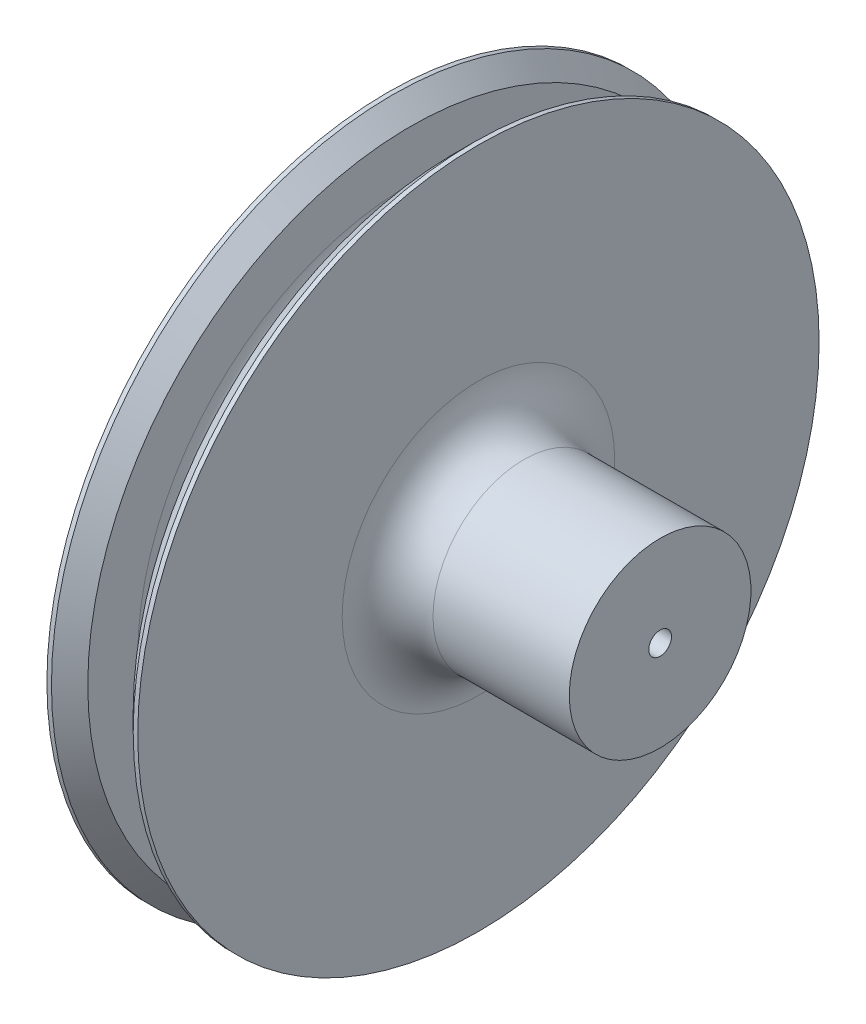
ISO-10303-21;
HEADER;
FILE_DESCRIPTION(('STEP AP214'),'2;1');
FILE_NAME('part.step','',(''),(''),'','','');
FILE_SCHEMA(('AUTOMOTIVE_DESIGN { 1 0 10303 214 1 1 1 1 }'));
ENDSEC;
DATA;
#1=APPLICATION_CONTEXT('core data for automotive mechanical design processes');
#2=APPLICATION_PROTOCOL_DEFINITION('international standard','automotive_design',2000,#1);
#3=PRODUCT_CONTEXT('',#1,'mechanical');
#4=PRODUCT('Part','Part','',(#3));
#5=PRODUCT_RELATED_PRODUCT_CATEGORY('part','',(#4));
#6=PRODUCT_DEFINITION_FORMATION('','',#4);
#7=PRODUCT_DEFINITION_CONTEXT('part definition',#1,'design');
#8=PRODUCT_DEFINITION('design','',#6,#7);
#9=PRODUCT_DEFINITION_SHAPE('','',#8);
#10=(LENGTH_UNIT() NAMED_UNIT(*) SI_UNIT(.MILLI.,.METRE.));
#11=(NAMED_UNIT(*) PLANE_ANGLE_UNIT() SI_UNIT($,.RADIAN.));
#12=(NAMED_UNIT(*) SI_UNIT($,.STERADIAN.) SOLID_ANGLE_UNIT());
#13=UNCERTAINTY_MEASURE_WITH_UNIT(LENGTH_MEASURE(1.E-05),#10,'distance_accuracy_value','');
#14=(GEOMETRIC_REPRESENTATION_CONTEXT(3) GLOBAL_UNCERTAINTY_ASSIGNED_CONTEXT((#13)) GLOBAL_UNIT_ASSIGNED_CONTEXT((#10,
#11,#12)) REPRESENTATION_CONTEXT('',''));
#15=CARTESIAN_POINT('',(0.,0.,0.));
#16=DIRECTION('',(0.,0.,1.));
#17=DIRECTION('',(1.,0.,0.));
#18=AXIS2_PLACEMENT_3D('',#15,#16,#17);
#19=CARTESIAN_POINT('',(0.,0.,0.));
#20=DIRECTION('',(-1.,0.,0.));
#21=DIRECTION('',(0.,0.,1.));
#22=AXIS2_PLACEMENT_3D('',#19,#20,#21);
#23=TOROIDAL_SURFACE('',#22,19.05,1.58750000000001);
#24=CARTESIAN_POINT('',(1.58750000000001,0.,0.));
#25=DIRECTION('',(-1.,0.,0.));
#26=DIRECTION('',(0.,0.,1.));
#27=AXIS2_PLACEMENT_3D('',#24,#25,#26);
#28=CIRCLE('',#27,19.05);
#29=CARTESIAN_POINT('',(1.58750000000001,0.,19.05));
#30=VERTEX_POINT('',#29);
#31=EDGE_CURVE('E69',#30,#30,#28,.T.);
#32=ORIENTED_EDGE('',*,*,#31,.T.);
#33=EDGE_LOOP('',(#32));
#34=FACE_BOUND('',#33,.T.);
#35=CARTESIAN_POINT('',(-1.58750000000001,0.,0.));
#36=DIRECTION('',(-1.,0.,0.));
#37=DIRECTION('',(0.,0.,1.));
#38=AXIS2_PLACEMENT_3D('',#35,#36,#37);
#39=CIRCLE('',#38,19.05);
#40=CARTESIAN_POINT('',(-1.58750000000001,0.,19.05));
#41=VERTEX_POINT('',#40);
#42=EDGE_CURVE('E78',#41,#41,#39,.T.);
#43=ORIENTED_EDGE('',*,*,#42,.F.);
#44=EDGE_LOOP('',(#43));
#45=FACE_BOUND('',#44,.T.);
#46=ADVANCED_FACE('F39',(#34,#45),#23,.F.);
#47=CARTESIAN_POINT('',(1.58750000000001,-19.05,0.));
#48=DIRECTION('',(-1.,0.,0.));
#49=DIRECTION('',(0.,0.,1.));
#50=AXIS2_PLACEMENT_3D('',#47,#48,#49);
#51=PLANE('',#50);
#52=CARTESIAN_POINT('',(1.58750000000001,0.,0.));
#53=DIRECTION('',(-1.,0.,0.));
#54=DIRECTION('',(0.,0.,1.));
#55=AXIS2_PLACEMENT_3D('',#52,#53,#54);
#56=CIRCLE('',#55,22.5425);
#57=CARTESIAN_POINT('',(1.58750000000001,0.,22.5425));
#58=VERTEX_POINT('',#57);
#59=EDGE_CURVE('E55',#58,#58,#56,.T.);
#60=ORIENTED_EDGE('',*,*,#59,.T.);
#61=EDGE_LOOP('',(#60));
#62=FACE_BOUND('',#61,.T.);
#63=ORIENTED_EDGE('',*,*,#31,.F.);
#64=EDGE_LOOP('',(#63));
#65=FACE_BOUND('',#64,.T.);
#66=ADVANCED_FACE('F114',(#62,#65),#51,.T.);
#67=CARTESIAN_POINT('',(-3.175,0.,0.));
#68=DIRECTION('',(-1.,0.,0.));
#69=DIRECTION('',(0.,0.,1.));
#70=AXIS2_PLACEMENT_3D('',#67,#68,#69);
#71=CYLINDRICAL_SURFACE('',#70,23.8125);
#72=CARTESIAN_POINT('',(2.85750000000003,0.,0.));
#73=DIRECTION('',(-1.,0.,0.));
#74=DIRECTION('',(0.,0.,1.));
#75=AXIS2_PLACEMENT_3D('',#72,#73,#74);
#76=CIRCLE('',#75,23.8125);
#77=CARTESIAN_POINT('',(2.85750000000003,0.,23.8125));
#78=VERTEX_POINT('',#77);
#79=EDGE_CURVE('E51',#78,#78,#76,.F.);
#80=ORIENTED_EDGE('',*,*,#79,.T.);
#81=EDGE_LOOP('',(#80));
#82=FACE_BOUND('',#81,.T.);
#83=CARTESIAN_POINT('',(3.175,0.,0.));
#84=DIRECTION('',(-1.,0.,0.));
#85=DIRECTION('',(0.,0.,1.));
#86=AXIS2_PLACEMENT_3D('',#83,#84,#85);
#87=CIRCLE('',#86,23.8125);
#88=CARTESIAN_POINT('',(3.175,0.,23.8125));
#89=VERTEX_POINT('',#88);
#90=EDGE_CURVE('E72',#89,#89,#87,.T.);
#91=ORIENTED_EDGE('',*,*,#90,.T.);
#92=EDGE_LOOP('',(#91));
#93=FACE_BOUND('',#92,.T.);
#94=ADVANCED_FACE('F121',(#82,#93),#71,.T.);
#95=CARTESIAN_POINT('',(3.175,0.,0.));
#96=DIRECTION('',(1.,0.,0.));
#97=DIRECTION('',(0.,0.,-1.));
#98=AXIS2_PLACEMENT_3D('',#95,#96,#97);
#99=PLANE('',#98);
#100=CARTESIAN_POINT('',(3.175,0.,0.));
#101=DIRECTION('',(1.,0.,0.));
#102=DIRECTION('',(0.,0.,-1.));
#103=AXIS2_PLACEMENT_3D('',#100,#101,#102);
#104=CIRCLE('',#103,9.525);
#105=CARTESIAN_POINT('',(3.175,0.,-9.525));
#106=VERTEX_POINT('',#105);
#107=EDGE_CURVE('E60',#106,#106,#104,.F.);
#108=ORIENTED_EDGE('',*,*,#107,.T.);
#109=EDGE_LOOP('',(#108));
#110=FACE_BOUND('',#109,.T.);
#111=ORIENTED_EDGE('',*,*,#90,.F.);
#112=EDGE_LOOP('',(#111));
#113=FACE_BOUND('',#112,.T.);
#114=ADVANCED_FACE('F148',(#110,#113),#99,.T.);
#115=CARTESIAN_POINT('',(-3.175,-23.8125,0.));
#116=DIRECTION('',(-1.,0.,0.));
#117=DIRECTION('',(0.,0.,1.));
#118=AXIS2_PLACEMENT_3D('',#115,#116,#117);
#119=PLANE('',#118);
#120=CARTESIAN_POINT('',(-3.175,0.,0.));
#121=DIRECTION('',(-1.,0.,0.));
#122=DIRECTION('',(0.,0.,1.));
#123=AXIS2_PLACEMENT_3D('',#120,#121,#122);
#124=CIRCLE('',#123,9.525);
#125=CARTESIAN_POINT('',(-3.175,0.,9.525));
#126=VERTEX_POINT('',#125);
#127=EDGE_CURVE('E66',#126,#126,#124,.F.);
#128=ORIENTED_EDGE('',*,*,#127,.T.);
#129=EDGE_LOOP('',(#128));
#130=FACE_BOUND('',#129,.T.);
#131=CARTESIAN_POINT('',(-3.175,0.,0.));
#132=DIRECTION('',(-1.,0.,0.));
#133=DIRECTION('',(0.,0.,1.));
#134=AXIS2_PLACEMENT_3D('',#131,#132,#133);
#135=CIRCLE('',#134,23.8125);
#136=CARTESIAN_POINT('',(-3.175,0.,23.8125));
#137=VERTEX_POINT('',#136);
#138=EDGE_CURVE('E75',#137,#137,#135,.T.);
#139=ORIENTED_EDGE('',*,*,#138,.T.);
#140=EDGE_LOOP('',(#139));
#141=FACE_BOUND('',#140,.T.);
#142=ADVANCED_FACE('F151',(#130,#141),#119,.T.);
#143=CARTESIAN_POINT('',(-3.175,0.,0.));
#144=DIRECTION('',(-1.,0.,0.));
#145=DIRECTION('',(0.,0.,1.));
#146=AXIS2_PLACEMENT_3D('',#143,#144,#145);
#147=CYLINDRICAL_SURFACE('',#146,23.8125);
#148=CARTESIAN_POINT('',(-2.85750000000002,0.,0.));
#149=DIRECTION('',(1.,0.,0.));
#150=DIRECTION('',(0.,0.,-1.));
#151=AXIS2_PLACEMENT_3D('',#148,#149,#150);
#152=CIRCLE('',#151,23.8125);
#153=CARTESIAN_POINT('',(-2.85750000000002,0.,23.8125));
#154=VERTEX_POINT('',#153);
#155=EDGE_CURVE('E47',#154,#154,#152,.F.);
#156=ORIENTED_EDGE('',*,*,#155,.T.);
#157=EDGE_LOOP('',(#156));
#158=FACE_BOUND('',#157,.T.);
#159=ORIENTED_EDGE('',*,*,#138,.F.);
#160=EDGE_LOOP('',(#159));
#161=FACE_BOUND('',#160,.T.);
#162=ADVANCED_FACE('F157',(#158,#161),#147,.T.);
#163=CARTESIAN_POINT('',(-1.58750000000001,-19.05,0.));
#164=DIRECTION('',(1.,0.,0.));
#165=DIRECTION('',(0.,0.,-1.));
#166=AXIS2_PLACEMENT_3D('',#163,#164,#165);
#167=PLANE('',#166);
#168=CARTESIAN_POINT('',(-1.58750000000001,0.,0.));
#169=DIRECTION('',(1.,0.,0.));
#170=DIRECTION('',(0.,0.,-1.));
#171=AXIS2_PLACEMENT_3D('',#168,#169,#170);
#172=CIRCLE('',#171,22.5425);
#173=CARTESIAN_POINT('',(-1.58750000000001,0.,22.5425));
#174=VERTEX_POINT('',#173);
#175=EDGE_CURVE('E10',#174,#174,#172,.T.);
#176=ORIENTED_EDGE('',*,*,#175,.T.);
#177=EDGE_LOOP('',(#176));
#178=FACE_BOUND('',#177,.T.);
#179=ORIENTED_EDGE('',*,*,#42,.T.);
#180=EDGE_LOOP('',(#179));
#181=FACE_BOUND('',#180,.T.);
#182=ADVANCED_FACE('F163',(#178,#181),#167,.T.);
#183=CARTESIAN_POINT('',(-6.35,0.,0.));
#184=DIRECTION('',(-1.,0.,0.));
#185=DIRECTION('',(0.,0.,1.));
#186=AXIS2_PLACEMENT_3D('',#183,#184,#185);
#187=PLANE('',#186);
#188=CARTESIAN_POINT('',(-6.35,0.,0.));
#189=DIRECTION('',(-1.,0.,0.));
#190=DIRECTION('',(0.,0.,1.));
#191=AXIS2_PLACEMENT_3D('',#188,#189,#190);
#192=CIRCLE('',#191,0.79375);
#193=CARTESIAN_POINT('',(-6.35,0.,0.79375));
#194=VERTEX_POINT('',#193);
#195=EDGE_CURVE('E87',#194,#194,#192,.T.);
#196=ORIENTED_EDGE('',*,*,#195,.F.);
#197=EDGE_LOOP('',(#196));
#198=FACE_BOUND('',#197,.T.);
#199=CARTESIAN_POINT('',(-6.35,0.,0.));
#200=DIRECTION('',(-1.,0.,0.));
#201=DIRECTION('',(0.,0.,1.));
#202=AXIS2_PLACEMENT_3D('',#199,#200,#201);
#203=CIRCLE('',#202,6.35);
#204=CARTESIAN_POINT('',(-6.35,0.,6.35));
#205=VERTEX_POINT('',#204);
#206=EDGE_CURVE('E84',#205,#205,#203,.T.);
#207=ORIENTED_EDGE('',*,*,#206,.T.);
#208=EDGE_LOOP('',(#207));
#209=FACE_BOUND('',#208,.T.);
#210=ADVANCED_FACE('F165',(#198,#209),#187,.T.);
#211=CARTESIAN_POINT('',(15.875,0.,0.));
#212=DIRECTION('',(-1.,0.,0.));
#213=DIRECTION('',(0.,0.,1.));
#214=AXIS2_PLACEMENT_3D('',#211,#212,#213);
#215=CYLINDRICAL_SURFACE('',#214,6.35);
#216=CARTESIAN_POINT('',(6.35,0.,0.));
#217=DIRECTION('',(1.,0.,0.));
#218=DIRECTION('',(0.,0.,-1.));
#219=AXIS2_PLACEMENT_3D('',#216,#217,#218);
#220=CIRCLE('',#219,6.35);
#221=CARTESIAN_POINT('',(6.35,0.,6.35));
#222=VERTEX_POINT('',#221);
#223=EDGE_CURVE('E63',#222,#222,#220,.T.);
#224=CARTESIAN_POINT('',(15.875,0.,0.));
#225=DIRECTION('',(-1.,0.,0.));
#226=DIRECTION('',(0.,0.,1.));
#227=AXIS2_PLACEMENT_3D('',#224,#225,#226);
#228=CIRCLE('',#227,6.35);
#229=CARTESIAN_POINT('',(15.875,0.,6.35));
#230=VERTEX_POINT('',#229);
#231=EDGE_CURVE('E81',#230,#230,#228,.T.);
#232=CARTESIAN_POINT('',(6.35,0.,6.35));
#233=CARTESIAN_POINT('',(6.44921875,0.,6.35));
#234=CARTESIAN_POINT('',(6.5484375,0.,6.35));
#235=CARTESIAN_POINT('',(6.746875,0.,6.35));
#236=CARTESIAN_POINT('',(6.84609375,0.,6.35));
#237=CARTESIAN_POINT('',(7.04453125,0.,6.35));
#238=CARTESIAN_POINT('',(7.14375,0.,6.35));
#239=CARTESIAN_POINT('',(7.3421875,0.,6.35));
#240=CARTESIAN_POINT('',(7.44140625,0.,6.35));
#241=CARTESIAN_POINT('',(7.63984375,0.,6.35));
#242=CARTESIAN_POINT('',(7.7390625,0.,6.35));
#243=CARTESIAN_POINT('',(7.9375,0.,6.35));
#244=CARTESIAN_POINT('',(8.03671875,0.,6.35));
#245=CARTESIAN_POINT('',(8.23515625,0.,6.35));
#246=CARTESIAN_POINT('',(8.334375,0.,6.35));
#247=CARTESIAN_POINT('',(8.5328125,0.,6.35));
#248=CARTESIAN_POINT('',(8.63203125,0.,6.35));
#249=CARTESIAN_POINT('',(8.83046875,0.,6.35));
#250=CARTESIAN_POINT('',(8.9296875,0.,6.35));
#251=CARTESIAN_POINT('',(9.128125,0.,6.35));
#252=CARTESIAN_POINT('',(9.22734375,0.,6.35));
#253=CARTESIAN_POINT('',(9.42578125,0.,6.35));
#254=CARTESIAN_POINT('',(9.525,0.,6.35));
#255=CARTESIAN_POINT('',(9.7234375,0.,6.35));
#256=CARTESIAN_POINT('',(9.82265625,0.,6.35));
#257=CARTESIAN_POINT('',(10.02109375,0.,6.35));
#258=CARTESIAN_POINT('',(10.1203125,0.,6.35));
#259=CARTESIAN_POINT('',(10.31875,0.,6.35));
#260=CARTESIAN_POINT('',(10.41796875,0.,6.35));
#261=CARTESIAN_POINT('',(10.61640625,0.,6.35));
#262=CARTESIAN_POINT('',(10.715625,0.,6.35));
#263=CARTESIAN_POINT('',(10.9140625,0.,6.35));
#264=CARTESIAN_POINT('',(11.01328125,0.,6.35));
#265=CARTESIAN_POINT('',(11.21171875,0.,6.35));
#266=CARTESIAN_POINT('',(11.3109375,0.,6.35));
#267=CARTESIAN_POINT('',(11.509375,0.,6.35));
#268=CARTESIAN_POINT('',(11.60859375,0.,6.35));
#269=CARTESIAN_POINT('',(11.80703125,0.,6.35));
#270=CARTESIAN_POINT('',(11.90625,0.,6.35));
#271=CARTESIAN_POINT('',(12.1046875,0.,6.35));
#272=CARTESIAN_POINT('',(12.20390625,0.,6.35));
#273=CARTESIAN_POINT('',(12.40234375,0.,6.35));
#274=CARTESIAN_POINT('',(12.5015625,0.,6.35));
#275=CARTESIAN_POINT('',(12.7,0.,6.35));
#276=CARTESIAN_POINT('',(12.79921875,0.,6.35));
#277=CARTESIAN_POINT('',(12.99765625,0.,6.35));
#278=CARTESIAN_POINT('',(13.096875,0.,6.35));
#279=CARTESIAN_POINT('',(13.2953125,0.,6.35));
#280=CARTESIAN_POINT('',(13.39453125,0.,6.35));
#281=CARTESIAN_POINT('',(13.59296875,0.,6.35));
#282=CARTESIAN_POINT('',(13.6921875,0.,6.35));
#283=CARTESIAN_POINT('',(13.890625,0.,6.35));
#284=CARTESIAN_POINT('',(13.98984375,0.,6.35));
#285=CARTESIAN_POINT('',(14.18828125,0.,6.35));
#286=CARTESIAN_POINT('',(14.2875,0.,6.35));
#287=CARTESIAN_POINT('',(14.4859375,0.,6.35));
#288=CARTESIAN_POINT('',(14.58515625,0.,6.35));
#289=CARTESIAN_POINT('',(14.78359375,0.,6.35));
#290=CARTESIAN_POINT('',(14.8828125,0.,6.35));
#291=CARTESIAN_POINT('',(15.08125,0.,6.35));
#292=CARTESIAN_POINT('',(15.18046875,0.,6.35));
#293=CARTESIAN_POINT('',(15.37890625,0.,6.35));
#294=CARTESIAN_POINT('',(15.478125,0.,6.35));
#295=CARTESIAN_POINT('',(15.6765625,0.,6.35));
#296=CARTESIAN_POINT('',(15.77578125,0.,6.35));
#297=CARTESIAN_POINT('',(15.875,0.,6.35));
#298=B_SPLINE_CURVE_WITH_KNOTS('',3,(#232,#233,#234,#235,#236,#237,#238,#239,#240,#241,#242,
#243,#244,#245,#246,#247,#248,#249,#250,#251,#252,#253,#254,#255,#256,#257,#258,#259,#260,#261,
#262,#263,#264,#265,#266,#267,#268,#269,#270,#271,#272,#273,#274,#275,#276,#277,#278,#279,#280,
#281,#282,#283,#284,#285,#286,#287,#288,#289,#290,#291,#292,#293,#294,#295,#296,#297),
.UNSPECIFIED.,.F.,.F.,(4,2,2,2,2,2,2,2,2,2,2,2,2,2,2,2,2,2,2,2,2,2,2,2,2,2,2,2,2,2,2,2,4),(0.,
0.29765625,0.5953125,0.892968750000001,1.190625,1.48828125,1.7859375,2.08359375,2.38125,
2.67890625,2.9765625,3.27421875,3.571875,3.86953125,4.1671875,4.46484375,4.7625,5.06015625,
5.3578125,5.65546875,5.953125,6.25078125,6.5484375,6.84609375,7.14375,7.44140625,7.7390625,
8.03671875,8.334375,8.63203125,8.9296875,9.22734375,9.525),.UNSPECIFIED.);
#299=EDGE_CURVE('BSEAM110',#222,#230,#298,.T.);
#300=ORIENTED_EDGE('',*,*,#223,.T.);
#301=ORIENTED_EDGE('',*,*,#231,.T.);
#302=ORIENTED_EDGE('',*,*,#299,.T.);
#303=ORIENTED_EDGE('',*,*,#299,.F.);
#304=EDGE_LOOP('',(#300,#302,#301,#303));
#305=FACE_BOUND('',#304,.T.);
#306=ADVANCED_FACE('F110',(#305),#215,.T.);
#307=CARTESIAN_POINT('',(15.875,0.,0.));
#308=DIRECTION('',(-1.,0.,0.));
#309=DIRECTION('',(0.,0.,1.));
#310=AXIS2_PLACEMENT_3D('',#307,#308,#309);
#311=PLANE('',#310);
#312=CARTESIAN_POINT('',(15.875,0.,0.));
#313=DIRECTION('',(-1.,0.,0.));
#314=DIRECTION('',(0.,0.,1.));
#315=AXIS2_PLACEMENT_3D('',#312,#313,#314);
#316=CIRCLE('',#315,0.79375);
#317=CARTESIAN_POINT('',(15.875,0.,0.79375));
#318=VERTEX_POINT('',#317);
#319=EDGE_CURVE('E90',#318,#318,#316,.T.);
#320=ORIENTED_EDGE('',*,*,#319,.T.);
#321=EDGE_LOOP('',(#320));
#322=FACE_BOUND('',#321,.T.);
#323=ORIENTED_EDGE('',*,*,#231,.F.);
#324=EDGE_LOOP('',(#323));
#325=FACE_BOUND('',#324,.T.);
#326=ADVANCED_FACE('F94',(#322,#325),#311,.F.);
#327=CARTESIAN_POINT('',(15.875,0.,0.));
#328=DIRECTION('',(-1.,0.,0.));
#329=DIRECTION('',(0.,0.,1.));
#330=AXIS2_PLACEMENT_3D('',#327,#328,#329);
#331=CYLINDRICAL_SURFACE('',#330,0.79375);
#332=ORIENTED_EDGE('',*,*,#195,.T.);
#333=EDGE_LOOP('',(#332));
#334=FACE_BOUND('',#333,.T.);
#335=ORIENTED_EDGE('',*,*,#319,.F.);
#336=EDGE_LOOP('',(#335));
#337=FACE_BOUND('',#336,.T.);
#338=ADVANCED_FACE('F97',(#334,#337),#331,.F.);
#339=CARTESIAN_POINT('',(-6.35,0.,0.));
#340=DIRECTION('',(-1.,0.,0.));
#341=DIRECTION('',(0.,0.,1.));
#342=AXIS2_PLACEMENT_3D('',#339,#340,#341);
#343=TOROIDAL_SURFACE('',#342,9.525,3.175);
#344=ORIENTED_EDGE('',*,*,#127,.F.);
#345=EDGE_LOOP('',(#344));
#346=FACE_BOUND('',#345,.T.);
#347=ORIENTED_EDGE('',*,*,#206,.F.);
#348=EDGE_LOOP('',(#347));
#349=FACE_BOUND('',#348,.T.);
#350=ADVANCED_FACE('F99',(#346,#349),#343,.F.);
#351=CARTESIAN_POINT('',(6.35,0.,0.));
#352=DIRECTION('',(1.,0.,0.));
#353=DIRECTION('',(0.,0.,-1.));
#354=AXIS2_PLACEMENT_3D('',#351,#352,#353);
#355=TOROIDAL_SURFACE('',#354,9.525,3.175);
#356=ORIENTED_EDGE('',*,*,#107,.F.);
#357=EDGE_LOOP('',(#356));
#358=FACE_BOUND('',#357,.T.);
#359=ORIENTED_EDGE('',*,*,#223,.F.);
#360=EDGE_LOOP('',(#359));
#361=FACE_BOUND('',#360,.T.);
#362=ADVANCED_FACE('F107',(#358,#361),#355,.F.);
#363=CARTESIAN_POINT('',(1.58750000000001,0.,0.));
#364=DIRECTION('',(1.,0.,0.));
#365=DIRECTION('',(0.,0.,-1.));
#366=AXIS2_PLACEMENT_3D('',#363,#364,#365);
#367=CONICAL_SURFACE('',#366,22.5425,0.785398163397447);
#368=ORIENTED_EDGE('',*,*,#79,.F.);
#369=EDGE_LOOP('',(#368));
#370=FACE_BOUND('',#369,.T.);
#371=ORIENTED_EDGE('',*,*,#59,.F.);
#372=EDGE_LOOP('',(#371));
#373=FACE_BOUND('',#372,.T.);
#374=ADVANCED_FACE('F128',(#370,#373),#367,.T.);
#375=CARTESIAN_POINT('',(-2.85750000000002,0.,0.));
#376=DIRECTION('',(-1.,0.,0.));
#377=DIRECTION('',(0.,0.,1.));
#378=AXIS2_PLACEMENT_3D('',#375,#376,#377);
#379=CONICAL_SURFACE('',#378,23.8125,0.785398163397448);
#380=CARTESIAN_POINT('',(-1.58750000000001,0.,22.5425));
#381=CARTESIAN_POINT('',(-1.60072916666667,0.,22.5557291666667));
#382=CARTESIAN_POINT('',(-1.61395833333334,0.,22.5689583333333));
#383=CARTESIAN_POINT('',(-1.64041666666667,0.,22.5954166666667));
#384=CARTESIAN_POINT('',(-1.65364583333334,0.,22.6086458333333));
#385=CARTESIAN_POINT('',(-1.68010416666667,0.,22.6351041666667));
#386=CARTESIAN_POINT('',(-1.69333333333334,0.,22.6483333333333));
#387=CARTESIAN_POINT('',(-1.71979166666667,0.,22.6747916666667));
#388=CARTESIAN_POINT('',(-1.73302083333334,0.,22.6880208333333));
#389=CARTESIAN_POINT('',(-1.75947916666667,0.,22.7144791666667));
#390=CARTESIAN_POINT('',(-1.77270833333334,0.,22.7277083333333));
#391=CARTESIAN_POINT('',(-1.79916666666667,0.,22.7541666666667));
#392=CARTESIAN_POINT('',(-1.81239583333334,0.,22.7673958333333));
#393=CARTESIAN_POINT('',(-1.83885416666667,0.,22.7938541666667));
#394=CARTESIAN_POINT('',(-1.85208333333334,0.,22.8070833333333));
#395=CARTESIAN_POINT('',(-1.87854166666667,0.,22.8335416666667));
#396=CARTESIAN_POINT('',(-1.89177083333334,0.,22.8467708333333));
#397=CARTESIAN_POINT('',(-1.91822916666668,0.,22.8732291666667));
#398=CARTESIAN_POINT('',(-1.93145833333334,0.,22.8864583333333));
#399=CARTESIAN_POINT('',(-1.95791666666668,0.,22.9129166666667));
#400=CARTESIAN_POINT('',(-1.97114583333334,0.,22.9261458333333));
#401=CARTESIAN_POINT('',(-1.99760416666668,0.,22.9526041666667));
#402=CARTESIAN_POINT('',(-2.01083333333334,0.,22.9658333333333));
#403=CARTESIAN_POINT('',(-2.03729166666668,0.,22.9922916666667));
#404=CARTESIAN_POINT('',(-2.05052083333334,0.,23.0055208333333));
#405=CARTESIAN_POINT('',(-2.07697916666668,0.,23.0319791666667));
#406=CARTESIAN_POINT('',(-2.09020833333334,0.,23.0452083333333));
#407=CARTESIAN_POINT('',(-2.11666666666668,0.,23.0716666666667));
#408=CARTESIAN_POINT('',(-2.12989583333334,0.,23.0848958333333));
#409=CARTESIAN_POINT('',(-2.15635416666668,0.,23.1113541666667));
#410=CARTESIAN_POINT('',(-2.16958333333334,0.,23.1245833333333));
#411=CARTESIAN_POINT('',(-2.19604166666668,0.,23.1510416666667));
#412=CARTESIAN_POINT('',(-2.20927083333334,0.,23.1642708333333));
#413=CARTESIAN_POINT('',(-2.23572916666668,0.,23.1907291666667));
#414=CARTESIAN_POINT('',(-2.24895833333334,0.,23.2039583333333));
#415=CARTESIAN_POINT('',(-2.27541666666668,0.,23.2304166666667));
#416=CARTESIAN_POINT('',(-2.28864583333335,0.,23.2436458333333));
#417=CARTESIAN_POINT('',(-2.31510416666668,0.,23.2701041666667));
#418=CARTESIAN_POINT('',(-2.32833333333335,0.,23.2833333333333));
#419=CARTESIAN_POINT('',(-2.35479166666668,0.,23.3097916666667));
#420=CARTESIAN_POINT('',(-2.36802083333335,0.,23.3230208333333));
#421=CARTESIAN_POINT('',(-2.39447916666668,0.,23.3494791666667));
#422=CARTESIAN_POINT('',(-2.40770833333335,0.,23.3627083333333));
#423=CARTESIAN_POINT('',(-2.43416666666668,0.,23.3891666666667));
#424=CARTESIAN_POINT('',(-2.44739583333335,0.,23.4023958333333));
#425=CARTESIAN_POINT('',(-2.47385416666668,0.,23.4288541666667));
#426=CARTESIAN_POINT('',(-2.48708333333335,0.,23.4420833333333));
#427=CARTESIAN_POINT('',(-2.51354166666668,0.,23.4685416666667));
#428=CARTESIAN_POINT('',(-2.52677083333335,0.,23.4817708333333));
#429=CARTESIAN_POINT('',(-2.55322916666668,0.,23.5082291666667));
#430=CARTESIAN_POINT('',(-2.56645833333335,0.,23.5214583333333));
#431=CARTESIAN_POINT('',(-2.59291666666668,0.,23.5479166666667));
#432=CARTESIAN_POINT('',(-2.60614583333335,0.,23.5611458333333));
#433=CARTESIAN_POINT('',(-2.63260416666668,0.,23.5876041666667));
#434=CARTESIAN_POINT('',(-2.64583333333335,0.,23.6008333333333));
#435=CARTESIAN_POINT('',(-2.67229166666668,0.,23.6272916666667));
#436=CARTESIAN_POINT('',(-2.68552083333335,0.,23.6405208333333));
#437=CARTESIAN_POINT('',(-2.71197916666668,0.,23.6669791666667));
#438=CARTESIAN_POINT('',(-2.72520833333335,0.,23.6802083333333));
#439=CARTESIAN_POINT('',(-2.75166666666668,0.,23.7066666666667));
#440=CARTESIAN_POINT('',(-2.76489583333335,0.,23.7198958333333));
#441=CARTESIAN_POINT('',(-2.79135416666668,0.,23.7463541666667));
#442=CARTESIAN_POINT('',(-2.80458333333335,0.,23.7595833333333));
#443=CARTESIAN_POINT('',(-2.83104166666668,0.,23.7860416666667));
#444=CARTESIAN_POINT('',(-2.84427083333335,0.,23.7992708333333));
#445=CARTESIAN_POINT('',(-2.85750000000002,0.,23.8125));
#446=B_SPLINE_CURVE_WITH_KNOTS('',3,(#380,#381,#382,#383,#384,#385,#386,#387,#388,#389,#390,
#391,#392,#393,#394,#395,#396,#397,#398,#399,#400,#401,#402,#403,#404,#405,#406,#407,#408,#409,
#410,#411,#412,#413,#414,#415,#416,#417,#418,#419,#420,#421,#422,#423,#424,#425,#426,#427,#428,
#429,#430,#431,#432,#433,#434,#435,#436,#437,#438,#439,#440,#441,#442,#443,#444,#445),
.UNSPECIFIED.,.F.,.F.,(4,2,2,2,2,2,2,2,2,2,2,2,2,2,2,2,2,2,2,2,2,2,2,2,2,2,2,2,2,2,2,2,4),(0.,
0.0561266007566824,0.112253201513365,0.168379802270049,0.224506403026732,0.280633003783414,
0.336759604540096,0.392886205296779,0.449012806053461,0.505139406810143,0.561266007566828,
0.61739260832351,0.673519209080193,0.729645809836875,0.785772410593557,0.841899011350239,
0.898025612106924,0.954152212863607,1.01027881362029,1.06640541437697,1.12253201513365,
1.17865861589034,1.23478521664702,1.2909118174037,1.34703841816039,1.40316501891707,
1.45929161967375,1.51541822043043,1.57154482118711,1.6276714219438,1.68379802270048,
1.73992462345716,1.79605122421385),.UNSPECIFIED.);
#447=EDGE_CURVE('BSEAM42',#174,#154,#446,.T.);
#448=ORIENTED_EDGE('',*,*,#175,.F.);
#449=ORIENTED_EDGE('',*,*,#155,.F.);
#450=ORIENTED_EDGE('',*,*,#447,.T.);
#451=ORIENTED_EDGE('',*,*,#447,.F.);
#452=EDGE_LOOP('',(#448,#450,#449,#451));
#453=FACE_BOUND('',#452,.T.);
#454=ADVANCED_FACE('F42',(#453),#379,.T.);
#455=CLOSED_SHELL('',(#46,#66,#94,#114,#142,#162,#182,#210,#306,#326,#338,#350,#362,#374,#454));
#456=MANIFOLD_SOLID_BREP('B2',#455);
#457=ADVANCED_BREP_SHAPE_REPRESENTATION('',(#18,#456),#14);
#458=SHAPE_DEFINITION_REPRESENTATION(#9,#457);
ENDSEC;
END-ISO-10303-21;
